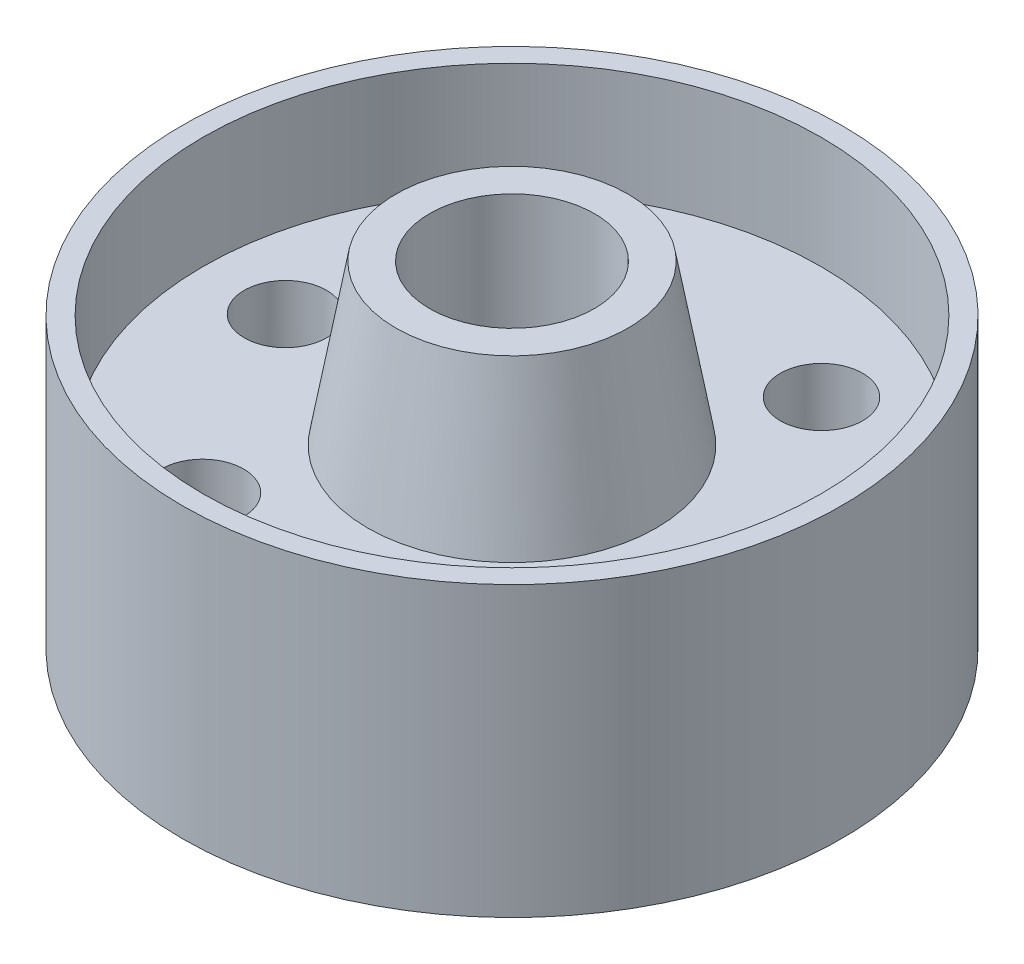
ISO-10303-21;
HEADER;
FILE_DESCRIPTION(('STEP AP214'),'2;1');
FILE_NAME('part.step','',(''),(''),'','','');
FILE_SCHEMA(('AUTOMOTIVE_DESIGN { 1 0 10303 214 1 1 1 1 }'));
ENDSEC;
DATA;
#1=APPLICATION_CONTEXT('core data for automotive mechanical design processes');
#2=APPLICATION_PROTOCOL_DEFINITION('international standard','automotive_design',2000,#1);
#3=PRODUCT_CONTEXT('',#1,'mechanical');
#4=PRODUCT('Part','Part','',(#3));
#5=PRODUCT_RELATED_PRODUCT_CATEGORY('part','',(#4));
#6=PRODUCT_DEFINITION_FORMATION('','',#4);
#7=PRODUCT_DEFINITION_CONTEXT('part definition',#1,'design');
#8=PRODUCT_DEFINITION('design','',#6,#7);
#9=PRODUCT_DEFINITION_SHAPE('','',#8);
#10=(LENGTH_UNIT() NAMED_UNIT(*) SI_UNIT(.MILLI.,.METRE.));
#11=(NAMED_UNIT(*) PLANE_ANGLE_UNIT() SI_UNIT($,.RADIAN.));
#12=(NAMED_UNIT(*) SI_UNIT($,.STERADIAN.) SOLID_ANGLE_UNIT());
#13=UNCERTAINTY_MEASURE_WITH_UNIT(LENGTH_MEASURE(1.E-05),#10,'distance_accuracy_value','');
#14=(GEOMETRIC_REPRESENTATION_CONTEXT(3) GLOBAL_UNCERTAINTY_ASSIGNED_CONTEXT((#13)) GLOBAL_UNIT_ASSIGNED_CONTEXT((#10,
#11,#12)) REPRESENTATION_CONTEXT('',''));
#15=CARTESIAN_POINT('',(0.,0.,0.));
#16=DIRECTION('',(0.,0.,1.));
#17=DIRECTION('',(1.,0.,0.));
#18=AXIS2_PLACEMENT_3D('',#15,#16,#17);
#19=CARTESIAN_POINT('',(0.,29.3624,-12.7));
#20=DIRECTION('',(0.,1.,0.));
#21=DIRECTION('',(0.,0.,1.));
#22=AXIS2_PLACEMENT_3D('',#19,#20,#21);
#23=CYLINDRICAL_SURFACE('',#22,50.8);
#24=CARTESIAN_POINT('',(0.,-22.352,-12.7));
#25=DIRECTION('',(0.,1.,0.));
#26=DIRECTION('',(0.,0.,1.));
#27=AXIS2_PLACEMENT_3D('',#24,#25,#26);
#28=CIRCLE('',#27,50.8);
#29=CARTESIAN_POINT('',(0.,-22.352,38.1));
#30=VERTEX_POINT('',#29);
#31=EDGE_CURVE('E83',#30,#30,#28,.T.);
#32=ORIENTED_EDGE('',*,*,#31,.T.);
#33=EDGE_LOOP('',(#32));
#34=FACE_BOUND('',#33,.T.);
#35=CARTESIAN_POINT('',(0.,22.098,-12.7));
#36=DIRECTION('',(0.,1.,0.));
#37=DIRECTION('',(0.,0.,1.));
#38=AXIS2_PLACEMENT_3D('',#35,#36,#37);
#39=CIRCLE('',#38,50.8);
#40=CARTESIAN_POINT('',(0.,22.098,38.1));
#41=VERTEX_POINT('',#40);
#42=EDGE_CURVE('E10',#41,#41,#39,.T.);
#43=ORIENTED_EDGE('',*,*,#42,.F.);
#44=EDGE_LOOP('',(#43));
#45=FACE_BOUND('',#44,.T.);
#46=ADVANCED_FACE('F40',(#34,#45),#23,.T.);
#47=CARTESIAN_POINT('',(0.,22.098,38.1));
#48=DIRECTION('',(0.,1.,0.));
#49=DIRECTION('',(0.,0.,1.));
#50=AXIS2_PLACEMENT_3D('',#47,#48,#49);
#51=PLANE('',#50);
#52=ORIENTED_EDGE('',*,*,#42,.T.);
#53=EDGE_LOOP('',(#52));
#54=FACE_BOUND('',#53,.T.);
#55=CARTESIAN_POINT('',(0.,22.098,-12.7));
#56=DIRECTION('',(0.,1.,0.));
#57=DIRECTION('',(0.,0.,1.));
#58=AXIS2_PLACEMENT_3D('',#55,#56,#57);
#59=CIRCLE('',#58,47.625);
#60=CARTESIAN_POINT('',(0.,22.098,34.925));
#61=VERTEX_POINT('',#60);
#62=EDGE_CURVE('E48',#61,#61,#59,.T.);
#63=ORIENTED_EDGE('',*,*,#62,.F.);
#64=EDGE_LOOP('',(#63));
#65=FACE_BOUND('',#64,.T.);
#66=ADVANCED_FACE('F138',(#54,#65),#51,.T.);
#67=CARTESIAN_POINT('',(0.,29.3624,-12.7));
#68=DIRECTION('',(0.,1.,0.));
#69=DIRECTION('',(0.,0.,1.));
#70=AXIS2_PLACEMENT_3D('',#67,#68,#69);
#71=CYLINDRICAL_SURFACE('',#70,47.625);
#72=ORIENTED_EDGE('',*,*,#62,.T.);
#73=EDGE_LOOP('',(#72));
#74=FACE_BOUND('',#73,.T.);
#75=CARTESIAN_POINT('',(0.,4.82599999999999,-12.7));
#76=DIRECTION('',(0.,1.,0.));
#77=DIRECTION('',(0.,0.,1.));
#78=AXIS2_PLACEMENT_3D('',#75,#76,#77);
#79=CIRCLE('',#78,47.625);
#80=CARTESIAN_POINT('',(0.,4.826,34.925));
#81=VERTEX_POINT('',#80);
#82=EDGE_CURVE('E55',#81,#81,#79,.T.);
#83=ORIENTED_EDGE('',*,*,#82,.F.);
#84=EDGE_LOOP('',(#83));
#85=FACE_BOUND('',#84,.T.);
#86=ADVANCED_FACE('F136',(#74,#85),#71,.F.);
#87=CARTESIAN_POINT('',(0.,4.826,34.925));
#88=DIRECTION('',(0.,1.,0.));
#89=DIRECTION('',(0.,0.,1.));
#90=AXIS2_PLACEMENT_3D('',#87,#88,#89);
#91=PLANE('',#90);
#92=CARTESIAN_POINT('',(-17.4625000000002,4.82599999999999,-42.9459372271714));
#93=DIRECTION('',(0.,1.,0.));
#94=DIRECTION('',(0.,0.,1.));
#95=AXIS2_PLACEMENT_3D('',#92,#93,#94);
#96=CIRCLE('',#95,6.35000000000001);
#97=CARTESIAN_POINT('',(-17.4625000000002,4.82599999999999,-36.5959372271714));
#98=VERTEX_POINT('',#97);
#99=EDGE_CURVE('E99',#98,#98,#96,.T.);
#100=ORIENTED_EDGE('',*,*,#99,.F.);
#101=EDGE_LOOP('',(#100));
#102=FACE_BOUND('',#101,.T.);
#103=CARTESIAN_POINT('',(-34.925,4.826,-12.7));
#104=DIRECTION('',(0.,1.,0.));
#105=DIRECTION('',(0.,0.,1.));
#106=AXIS2_PLACEMENT_3D('',#103,#104,#105);
#107=CIRCLE('',#106,6.35);
#108=CARTESIAN_POINT('',(-34.925,4.826,-6.35));
#109=VERTEX_POINT('',#108);
#110=EDGE_CURVE('E64',#109,#109,#107,.T.);
#111=ORIENTED_EDGE('',*,*,#110,.F.);
#112=EDGE_LOOP('',(#111));
#113=FACE_BOUND('',#112,.T.);
#114=CARTESIAN_POINT('',(17.4624999999997,4.826,17.5459372271717));
#115=DIRECTION('',(0.,1.,0.));
#116=DIRECTION('',(0.,0.,1.));
#117=AXIS2_PLACEMENT_3D('',#114,#115,#116);
#118=CIRCLE('',#117,6.35000000000001);
#119=CARTESIAN_POINT('',(17.4624999999997,4.826,23.8959372271717));
#120=VERTEX_POINT('',#119);
#121=EDGE_CURVE('E359',#120,#120,#118,.T.);
#122=ORIENTED_EDGE('',*,*,#121,.F.);
#123=EDGE_LOOP('',(#122));
#124=FACE_BOUND('',#123,.T.);
#125=CARTESIAN_POINT('',(34.925,4.826,-12.7));
#126=DIRECTION('',(0.,1.,0.));
#127=DIRECTION('',(0.,0.,1.));
#128=AXIS2_PLACEMENT_3D('',#125,#126,#127);
#129=CIRCLE('',#128,6.35);
#130=CARTESIAN_POINT('',(34.925,4.826,-6.35));
#131=VERTEX_POINT('',#130);
#132=EDGE_CURVE('E353',#131,#131,#129,.T.);
#133=ORIENTED_EDGE('',*,*,#132,.F.);
#134=EDGE_LOOP('',(#133));
#135=FACE_BOUND('',#134,.T.);
#136=CARTESIAN_POINT('',(17.4625000000002,4.82599999999999,-42.9459372271714));
#137=DIRECTION('',(0.,1.,0.));
#138=DIRECTION('',(0.,0.,1.));
#139=AXIS2_PLACEMENT_3D('',#136,#137,#138);
#140=CIRCLE('',#139,6.35);
#141=CARTESIAN_POINT('',(17.4625000000002,4.82599999999999,-36.5959372271714));
#142=VERTEX_POINT('',#141);
#143=EDGE_CURVE('E364',#142,#142,#140,.T.);
#144=ORIENTED_EDGE('',*,*,#143,.F.);
#145=EDGE_LOOP('',(#144));
#146=FACE_BOUND('',#145,.T.);
#147=CARTESIAN_POINT('',(-17.4625000000001,4.826,17.5459372271714));
#148=DIRECTION('',(0.,1.,0.));
#149=DIRECTION('',(0.,0.,1.));
#150=AXIS2_PLACEMENT_3D('',#147,#148,#149);
#151=CIRCLE('',#150,6.35);
#152=CARTESIAN_POINT('',(-17.4625000000001,4.826,23.8959372271714));
#153=VERTEX_POINT('',#152);
#154=EDGE_CURVE('E363',#153,#153,#151,.T.);
#155=ORIENTED_EDGE('',*,*,#154,.F.);
#156=EDGE_LOOP('',(#155));
#157=FACE_BOUND('',#156,.T.);
#158=ORIENTED_EDGE('',*,*,#82,.T.);
#159=EDGE_LOOP('',(#158));
#160=FACE_BOUND('',#159,.T.);
#161=CARTESIAN_POINT('',(0.,4.826,-12.7));
#162=DIRECTION('',(0.,1.,0.));
#163=DIRECTION('',(0.,0.,1.));
#164=AXIS2_PLACEMENT_3D('',#161,#162,#163);
#165=CIRCLE('',#164,22.225);
#166=CARTESIAN_POINT('',(0.,4.826,9.525));
#167=VERTEX_POINT('',#166);
#168=EDGE_CURVE('E125',#167,#167,#165,.T.);
#169=ORIENTED_EDGE('',*,*,#168,.F.);
#170=EDGE_LOOP('',(#169));
#171=FACE_BOUND('',#170,.T.);
#172=ADVANCED_FACE('F133',(#102,#113,#124,#135,#146,#157,#160,#171),#91,.T.);
#173=CARTESIAN_POINT('',(0.,29.3624,-12.7));
#174=DIRECTION('',(0.,-1.,0.));
#175=DIRECTION('',(0.,0.,-1.));
#176=AXIS2_PLACEMENT_3D('',#173,#174,#175);
#177=CONICAL_SURFACE('',#176,17.898570670545,0.174532925199426);
#178=ORIENTED_EDGE('',*,*,#168,.T.);
#179=EDGE_LOOP('',(#178));
#180=FACE_BOUND('',#179,.T.);
#181=CARTESIAN_POINT('',(0.,29.3624,-12.7));
#182=DIRECTION('',(0.,1.,0.));
#183=DIRECTION('',(0.,0.,1.));
#184=AXIS2_PLACEMENT_3D('',#181,#182,#183);
#185=CIRCLE('',#184,17.898570670545);
#186=CARTESIAN_POINT('',(0.,29.3624,5.198570670545));
#187=VERTEX_POINT('',#186);
#188=EDGE_CURVE('E121',#187,#187,#185,.T.);
#189=ORIENTED_EDGE('',*,*,#188,.F.);
#190=EDGE_LOOP('',(#189));
#191=FACE_BOUND('',#190,.T.);
#192=ADVANCED_FACE('F145',(#180,#191),#177,.T.);
#193=CARTESIAN_POINT('',(0.,29.3624,5.198570670545));
#194=DIRECTION('',(0.,1.,0.));
#195=DIRECTION('',(0.,0.,1.));
#196=AXIS2_PLACEMENT_3D('',#193,#194,#195);
#197=PLANE('',#196);
#198=ORIENTED_EDGE('',*,*,#188,.T.);
#199=EDGE_LOOP('',(#198));
#200=FACE_BOUND('',#199,.T.);
#201=CARTESIAN_POINT('',(0.,29.3624,-12.7));
#202=DIRECTION('',(0.,1.,0.));
#203=DIRECTION('',(0.,0.,1.));
#204=AXIS2_PLACEMENT_3D('',#201,#202,#203);
#205=CIRCLE('',#204,12.7);
#206=CARTESIAN_POINT('',(0.,29.3624,0.));
#207=VERTEX_POINT('',#206);
#208=EDGE_CURVE('E117',#207,#207,#205,.T.);
#209=ORIENTED_EDGE('',*,*,#208,.F.);
#210=EDGE_LOOP('',(#209));
#211=FACE_BOUND('',#210,.T.);
#212=ADVANCED_FACE('F177',(#200,#211),#197,.T.);
#213=CARTESIAN_POINT('',(0.,29.3624,-12.7));
#214=DIRECTION('',(0.,1.,0.));
#215=DIRECTION('',(0.,0.,1.));
#216=AXIS2_PLACEMENT_3D('',#213,#214,#215);
#217=CYLINDRICAL_SURFACE('',#216,12.7);
#218=ORIENTED_EDGE('',*,*,#208,.T.);
#219=EDGE_LOOP('',(#218));
#220=FACE_BOUND('',#219,.T.);
#221=CARTESIAN_POINT('',(0.,-29.3624,-12.7));
#222=DIRECTION('',(0.,1.,0.));
#223=DIRECTION('',(0.,0.,1.));
#224=AXIS2_PLACEMENT_3D('',#221,#222,#223);
#225=CIRCLE('',#224,12.7);
#226=CARTESIAN_POINT('',(0.,-29.3624,0.));
#227=VERTEX_POINT('',#226);
#228=EDGE_CURVE('E113',#227,#227,#225,.T.);
#229=ORIENTED_EDGE('',*,*,#228,.F.);
#230=EDGE_LOOP('',(#229));
#231=FACE_BOUND('',#230,.T.);
#232=ADVANCED_FACE('F187',(#220,#231),#217,.F.);
#233=CARTESIAN_POINT('',(0.,-29.3624,5.19857067054499));
#234=DIRECTION('',(0.,-1.,0.));
#235=DIRECTION('',(0.,0.,-1.));
#236=AXIS2_PLACEMENT_3D('',#233,#234,#235);
#237=PLANE('',#236);
#238=ORIENTED_EDGE('',*,*,#228,.T.);
#239=EDGE_LOOP('',(#238));
#240=FACE_BOUND('',#239,.T.);
#241=CARTESIAN_POINT('',(0.,-29.3624,-12.7));
#242=DIRECTION('',(0.,1.,0.));
#243=DIRECTION('',(0.,0.,1.));
#244=AXIS2_PLACEMENT_3D('',#241,#242,#243);
#245=CIRCLE('',#244,17.898570670545);
#246=CARTESIAN_POINT('',(0.,-29.3624,5.19857067054499));
#247=VERTEX_POINT('',#246);
#248=EDGE_CURVE('E109',#247,#247,#245,.T.);
#249=ORIENTED_EDGE('',*,*,#248,.F.);
#250=EDGE_LOOP('',(#249));
#251=FACE_BOUND('',#250,.T.);
#252=ADVANCED_FACE('F197',(#240,#251),#237,.T.);
#253=CARTESIAN_POINT('',(0.,-4.826,-12.7));
#254=DIRECTION('',(0.,1.,0.));
#255=DIRECTION('',(0.,0.,1.));
#256=AXIS2_PLACEMENT_3D('',#253,#254,#255);
#257=CONICAL_SURFACE('',#256,22.225,0.174532925199426);
#258=ORIENTED_EDGE('',*,*,#248,.T.);
#259=EDGE_LOOP('',(#258));
#260=FACE_BOUND('',#259,.T.);
#261=CARTESIAN_POINT('',(0.,-4.826,-12.7));
#262=DIRECTION('',(0.,1.,0.));
#263=DIRECTION('',(0.,0.,1.));
#264=AXIS2_PLACEMENT_3D('',#261,#262,#263);
#265=CIRCLE('',#264,22.225);
#266=CARTESIAN_POINT('',(0.,-4.826,9.525));
#267=VERTEX_POINT('',#266);
#268=EDGE_CURVE('E105',#267,#267,#265,.T.);
#269=ORIENTED_EDGE('',*,*,#268,.F.);
#270=EDGE_LOOP('',(#269));
#271=FACE_BOUND('',#270,.T.);
#272=ADVANCED_FACE('F207',(#260,#271),#257,.T.);
#273=CARTESIAN_POINT('',(0.,-4.826,34.925));
#274=DIRECTION('',(0.,-1.,0.));
#275=DIRECTION('',(0.,0.,-1.));
#276=AXIS2_PLACEMENT_3D('',#273,#274,#275);
#277=PLANE('',#276);
#278=CARTESIAN_POINT('',(-34.925,-4.82600000000001,-12.7));
#279=DIRECTION('',(0.,-1.,0.));
#280=DIRECTION('',(0.,0.,-1.));
#281=AXIS2_PLACEMENT_3D('',#278,#279,#280);
#282=CIRCLE('',#281,6.35);
#283=CARTESIAN_POINT('',(-34.925,-4.82600000000001,-19.05));
#284=VERTEX_POINT('',#283);
#285=EDGE_CURVE('E43',#284,#284,#282,.T.);
#286=ORIENTED_EDGE('',*,*,#285,.F.);
#287=EDGE_LOOP('',(#286));
#288=FACE_BOUND('',#287,.T.);
#289=CARTESIAN_POINT('',(17.4624999999997,-4.826,17.5459372271717));
#290=DIRECTION('',(0.,-1.,0.));
#291=DIRECTION('',(0.,0.,-1.));
#292=AXIS2_PLACEMENT_3D('',#289,#290,#291);
#293=CIRCLE('',#292,6.35000000000001);
#294=CARTESIAN_POINT('',(17.4624999999997,-4.826,11.1959372271717));
#295=VERTEX_POINT('',#294);
#296=EDGE_CURVE('E75',#295,#295,#293,.T.);
#297=ORIENTED_EDGE('',*,*,#296,.F.);
#298=EDGE_LOOP('',(#297));
#299=FACE_BOUND('',#298,.T.);
#300=CARTESIAN_POINT('',(34.925,-4.82600000000001,-12.7));
#301=DIRECTION('',(0.,-1.,0.));
#302=DIRECTION('',(0.,0.,-1.));
#303=AXIS2_PLACEMENT_3D('',#300,#301,#302);
#304=CIRCLE('',#303,6.35);
#305=CARTESIAN_POINT('',(34.925,-4.82600000000001,-19.05));
#306=VERTEX_POINT('',#305);
#307=EDGE_CURVE('E72',#306,#306,#304,.T.);
#308=ORIENTED_EDGE('',*,*,#307,.F.);
#309=EDGE_LOOP('',(#308));
#310=FACE_BOUND('',#309,.T.);
#311=CARTESIAN_POINT('',(-17.4625000000002,-4.826,-42.9459372271714));
#312=DIRECTION('',(0.,-1.,0.));
#313=DIRECTION('',(0.,0.,-1.));
#314=AXIS2_PLACEMENT_3D('',#311,#312,#313);
#315=CIRCLE('',#314,6.35000000000001);
#316=CARTESIAN_POINT('',(-17.4625000000002,-4.826,-49.2959372271714));
#317=VERTEX_POINT('',#316);
#318=EDGE_CURVE('E68',#317,#317,#315,.T.);
#319=ORIENTED_EDGE('',*,*,#318,.F.);
#320=EDGE_LOOP('',(#319));
#321=FACE_BOUND('',#320,.T.);
#322=CARTESIAN_POINT('',(17.4625000000002,-4.826,-42.9459372271714));
#323=DIRECTION('',(0.,-1.,0.));
#324=DIRECTION('',(0.,0.,-1.));
#325=AXIS2_PLACEMENT_3D('',#322,#323,#324);
#326=CIRCLE('',#325,6.35);
#327=CARTESIAN_POINT('',(17.4625000000002,-4.826,-49.2959372271714));
#328=VERTEX_POINT('',#327);
#329=EDGE_CURVE('E63',#328,#328,#326,.T.);
#330=ORIENTED_EDGE('',*,*,#329,.F.);
#331=EDGE_LOOP('',(#330));
#332=FACE_BOUND('',#331,.T.);
#333=CARTESIAN_POINT('',(-17.4625000000001,-4.826,17.5459372271714));
#334=DIRECTION('',(0.,-1.,0.));
#335=DIRECTION('',(0.,0.,-1.));
#336=AXIS2_PLACEMENT_3D('',#333,#334,#335);
#337=CIRCLE('',#336,6.35);
#338=CARTESIAN_POINT('',(-17.4625000000001,-4.826,11.1959372271714));
#339=VERTEX_POINT('',#338);
#340=EDGE_CURVE('E59',#339,#339,#337,.T.);
#341=ORIENTED_EDGE('',*,*,#340,.F.);
#342=EDGE_LOOP('',(#341));
#343=FACE_BOUND('',#342,.T.);
#344=ORIENTED_EDGE('',*,*,#268,.T.);
#345=EDGE_LOOP('',(#344));
#346=FACE_BOUND('',#345,.T.);
#347=CARTESIAN_POINT('',(0.,-4.826,-12.7));
#348=DIRECTION('',(0.,1.,0.));
#349=DIRECTION('',(0.,0.,1.));
#350=AXIS2_PLACEMENT_3D('',#347,#348,#349);
#351=CIRCLE('',#350,47.625);
#352=CARTESIAN_POINT('',(0.,-4.826,34.925));
#353=VERTEX_POINT('',#352);
#354=EDGE_CURVE('E96',#353,#353,#351,.T.);
#355=ORIENTED_EDGE('',*,*,#354,.F.);
#356=EDGE_LOOP('',(#355));
#357=FACE_BOUND('',#356,.T.);
#358=ADVANCED_FACE('F217',(#288,#299,#310,#321,#332,#343,#346,#357),#277,.T.);
#359=CARTESIAN_POINT('',(0.,29.3624,-12.7));
#360=DIRECTION('',(0.,1.,0.));
#361=DIRECTION('',(0.,0.,1.));
#362=AXIS2_PLACEMENT_3D('',#359,#360,#361);
#363=CYLINDRICAL_SURFACE('',#362,47.625);
#364=ORIENTED_EDGE('',*,*,#354,.T.);
#365=EDGE_LOOP('',(#364));
#366=FACE_BOUND('',#365,.T.);
#367=CARTESIAN_POINT('',(0.,-22.352,-12.7));
#368=DIRECTION('',(0.,1.,0.));
#369=DIRECTION('',(0.,0.,1.));
#370=AXIS2_PLACEMENT_3D('',#367,#368,#369);
#371=CIRCLE('',#370,47.625);
#372=CARTESIAN_POINT('',(0.,-22.352,34.925));
#373=VERTEX_POINT('',#372);
#374=EDGE_CURVE('E89',#373,#373,#371,.T.);
#375=ORIENTED_EDGE('',*,*,#374,.F.);
#376=EDGE_LOOP('',(#375));
#377=FACE_BOUND('',#376,.T.);
#378=ADVANCED_FACE('F227',(#366,#377),#363,.F.);
#379=CARTESIAN_POINT('',(0.,-22.352,34.925));
#380=DIRECTION('',(0.,-1.,0.));
#381=DIRECTION('',(0.,0.,-1.));
#382=AXIS2_PLACEMENT_3D('',#379,#380,#381);
#383=PLANE('',#382);
#384=ORIENTED_EDGE('',*,*,#374,.T.);
#385=EDGE_LOOP('',(#384));
#386=FACE_BOUND('',#385,.T.);
#387=ORIENTED_EDGE('',*,*,#31,.F.);
#388=EDGE_LOOP('',(#387));
#389=FACE_BOUND('',#388,.T.);
#390=ADVANCED_FACE('F237',(#386,#389),#383,.T.);
#391=CARTESIAN_POINT('',(-17.4625000000001,-29.3624,17.5459372271714));
#392=DIRECTION('',(0.,1.,0.));
#393=DIRECTION('',(0.,0.,1.));
#394=AXIS2_PLACEMENT_3D('',#391,#392,#393);
#395=CYLINDRICAL_SURFACE('',#394,6.35);
#396=ORIENTED_EDGE('',*,*,#340,.T.);
#397=EDGE_LOOP('',(#396));
#398=FACE_BOUND('',#397,.T.);
#399=ORIENTED_EDGE('',*,*,#154,.T.);
#400=EDGE_LOOP('',(#399));
#401=FACE_BOUND('',#400,.T.);
#402=ADVANCED_FACE('F246',(#398,#401),#395,.F.);
#403=CARTESIAN_POINT('',(17.4625000000002,-29.3624,-42.9459372271714));
#404=DIRECTION('',(0.,1.,0.));
#405=DIRECTION('',(0.,0.,1.));
#406=AXIS2_PLACEMENT_3D('',#403,#404,#405);
#407=CYLINDRICAL_SURFACE('',#406,6.35);
#408=ORIENTED_EDGE('',*,*,#329,.T.);
#409=EDGE_LOOP('',(#408));
#410=FACE_BOUND('',#409,.T.);
#411=ORIENTED_EDGE('',*,*,#143,.T.);
#412=EDGE_LOOP('',(#411));
#413=FACE_BOUND('',#412,.T.);
#414=ADVANCED_FACE('F255',(#410,#413),#407,.F.);
#415=CARTESIAN_POINT('',(-17.4625000000002,-29.3624,-42.9459372271714));
#416=DIRECTION('',(0.,1.,0.));
#417=DIRECTION('',(0.,0.,1.));
#418=AXIS2_PLACEMENT_3D('',#415,#416,#417);
#419=CYLINDRICAL_SURFACE('',#418,6.35000000000001);
#420=ORIENTED_EDGE('',*,*,#318,.T.);
#421=EDGE_LOOP('',(#420));
#422=FACE_BOUND('',#421,.T.);
#423=ORIENTED_EDGE('',*,*,#99,.T.);
#424=EDGE_LOOP('',(#423));
#425=FACE_BOUND('',#424,.T.);
#426=ADVANCED_FACE('F265',(#422,#425),#419,.F.);
#427=CARTESIAN_POINT('',(34.925,-29.3624,-12.7));
#428=DIRECTION('',(0.,1.,0.));
#429=DIRECTION('',(0.,0.,1.));
#430=AXIS2_PLACEMENT_3D('',#427,#428,#429);
#431=CYLINDRICAL_SURFACE('',#430,6.35);
#432=ORIENTED_EDGE('',*,*,#307,.T.);
#433=EDGE_LOOP('',(#432));
#434=FACE_BOUND('',#433,.T.);
#435=ORIENTED_EDGE('',*,*,#132,.T.);
#436=EDGE_LOOP('',(#435));
#437=FACE_BOUND('',#436,.T.);
#438=ADVANCED_FACE('F275',(#434,#437),#431,.F.);
#439=CARTESIAN_POINT('',(17.4624999999997,-29.3624,17.5459372271717));
#440=DIRECTION('',(0.,1.,0.));
#441=DIRECTION('',(0.,0.,1.));
#442=AXIS2_PLACEMENT_3D('',#439,#440,#441);
#443=CYLINDRICAL_SURFACE('',#442,6.35000000000001);
#444=ORIENTED_EDGE('',*,*,#296,.T.);
#445=EDGE_LOOP('',(#444));
#446=FACE_BOUND('',#445,.T.);
#447=ORIENTED_EDGE('',*,*,#121,.T.);
#448=EDGE_LOOP('',(#447));
#449=FACE_BOUND('',#448,.T.);
#450=ADVANCED_FACE('F285',(#446,#449),#443,.F.);
#451=CARTESIAN_POINT('',(-34.925,-29.3624,-12.7));
#452=DIRECTION('',(0.,1.,0.));
#453=DIRECTION('',(0.,0.,1.));
#454=AXIS2_PLACEMENT_3D('',#451,#452,#453);
#455=CYLINDRICAL_SURFACE('',#454,6.35);
#456=ORIENTED_EDGE('',*,*,#285,.T.);
#457=EDGE_LOOP('',(#456));
#458=FACE_BOUND('',#457,.T.);
#459=ORIENTED_EDGE('',*,*,#110,.T.);
#460=EDGE_LOOP('',(#459));
#461=FACE_BOUND('',#460,.T.);
#462=ADVANCED_FACE('F295',(#458,#461),#455,.F.);
#463=CLOSED_SHELL('',(#46,#66,#86,#172,#192,#212,#232,#252,#272,#358,#378,#390,#402,#414,#426,
#438,#450,#462));
#464=MANIFOLD_SOLID_BREP('B2',#463);
#465=ADVANCED_BREP_SHAPE_REPRESENTATION('',(#18,#464),#14);
#466=SHAPE_DEFINITION_REPRESENTATION(#9,#465);
ENDSEC;
END-ISO-10303-21;
